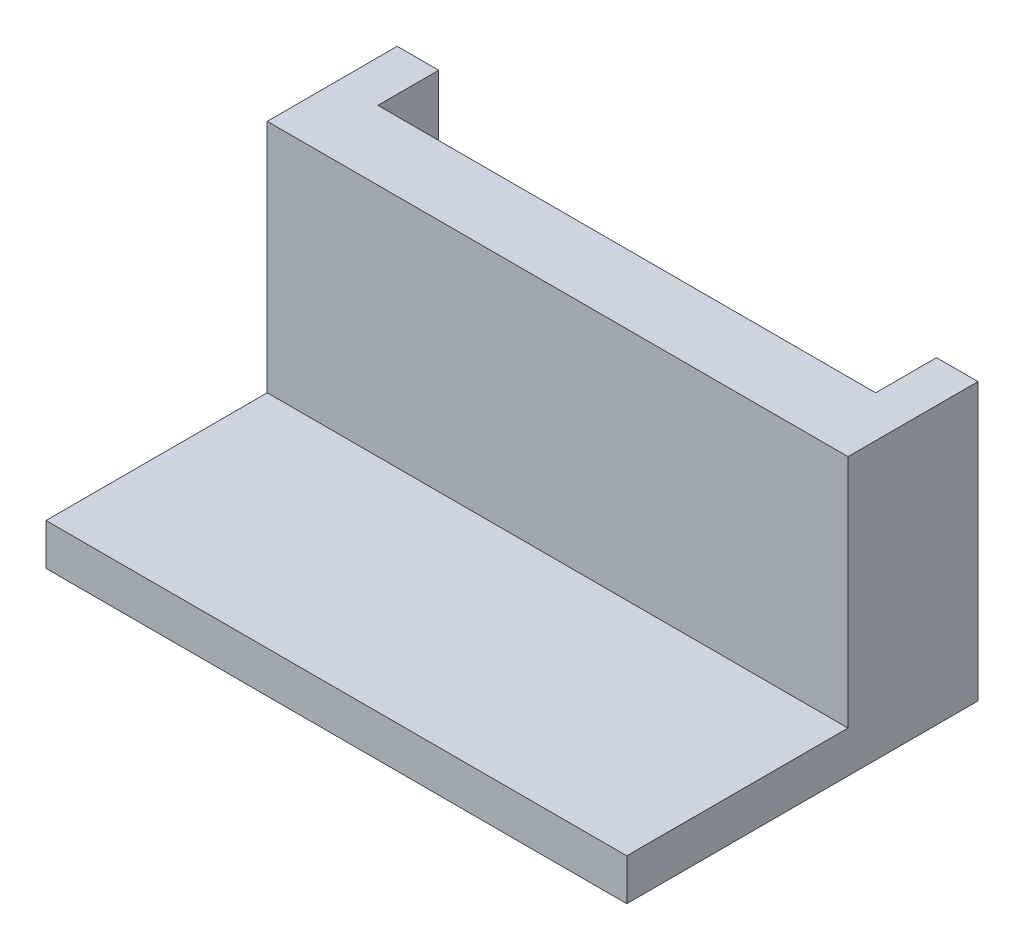
ISO-10303-21;
HEADER;
FILE_DESCRIPTION(('STEP AP214'),'2;1');
FILE_NAME('part.step','',(''),(''),'','','');
FILE_SCHEMA(('AUTOMOTIVE_DESIGN { 1 0 10303 214 1 1 1 1 }'));
ENDSEC;
DATA;
#1=APPLICATION_CONTEXT('core data for automotive mechanical design processes');
#2=APPLICATION_PROTOCOL_DEFINITION('international standard','automotive_design',2000,#1);
#3=PRODUCT_CONTEXT('',#1,'mechanical');
#4=PRODUCT('Part','Part','',(#3));
#5=PRODUCT_RELATED_PRODUCT_CATEGORY('part','',(#4));
#6=PRODUCT_DEFINITION_FORMATION('','',#4);
#7=PRODUCT_DEFINITION_CONTEXT('part definition',#1,'design');
#8=PRODUCT_DEFINITION('design','',#6,#7);
#9=PRODUCT_DEFINITION_SHAPE('','',#8);
#10=(LENGTH_UNIT() NAMED_UNIT(*) SI_UNIT(.MILLI.,.METRE.));
#11=(NAMED_UNIT(*) PLANE_ANGLE_UNIT() SI_UNIT($,.RADIAN.));
#12=(NAMED_UNIT(*) SI_UNIT($,.STERADIAN.) SOLID_ANGLE_UNIT());
#13=UNCERTAINTY_MEASURE_WITH_UNIT(LENGTH_MEASURE(1.E-05),#10,'distance_accuracy_value','');
#14=(GEOMETRIC_REPRESENTATION_CONTEXT(3) GLOBAL_UNCERTAINTY_ASSIGNED_CONTEXT((#13)) GLOBAL_UNIT_ASSIGNED_CONTEXT((#10,
#11,#12)) REPRESENTATION_CONTEXT('',''));
#15=CARTESIAN_POINT('',(0.,0.,0.));
#16=DIRECTION('',(0.,0.,1.));
#17=DIRECTION('',(1.,0.,0.));
#18=AXIS2_PLACEMENT_3D('',#15,#16,#17);
#19=CARTESIAN_POINT('',(-3.08154506437768,1.5,3.19785407725322));
#20=DIRECTION('',(0.,0.,-1.));
#21=DIRECTION('',(-1.,0.,0.));
#22=AXIS2_PLACEMENT_3D('',#19,#20,#21);
#23=PLANE('',#22);
#24=DIRECTION('',(-1.,0.,0.));
#25=VECTOR('',#24,1.);
#26=CARTESIAN_POINT('',(-4.58154506437768,1.5,3.19785407725322));
#27=LINE('',#26,#25);
#28=CARTESIAN_POINT('',(16.4184549356223,1.5,3.19785407725322));
#29=VERTEX_POINT('',#28);
#30=CARTESIAN_POINT('',(-4.58154506437768,1.5,3.19785407725322));
#31=VERTEX_POINT('',#30);
#32=EDGE_CURVE('E48',#29,#31,#27,.T.);
#33=ORIENTED_EDGE('',*,*,#32,.F.);
#34=DIRECTION('',(0.,-1.,0.));
#35=VECTOR('',#34,1.);
#36=CARTESIAN_POINT('',(16.4184549356223,10.,3.19785407725322));
#37=LINE('',#36,#35);
#38=CARTESIAN_POINT('',(16.4184549356223,10.,3.19785407725322));
#39=VERTEX_POINT('',#38);
#40=EDGE_CURVE('E194',#39,#29,#37,.T.);
#41=ORIENTED_EDGE('',*,*,#40,.F.);
#42=DIRECTION('',(1.,0.,0.));
#43=VECTOR('',#42,1.);
#44=CARTESIAN_POINT('',(-3.08154506437768,10.,3.19785407725322));
#45=LINE('',#44,#43);
#46=CARTESIAN_POINT('',(-4.58154506437768,10.,3.19785407725322));
#47=VERTEX_POINT('',#46);
#48=EDGE_CURVE('E209',#47,#39,#45,.T.);
#49=ORIENTED_EDGE('',*,*,#48,.F.);
#50=DIRECTION('',(0.,1.,0.));
#51=VECTOR('',#50,1.);
#52=CARTESIAN_POINT('',(-4.58154506437768,10.,3.19785407725322));
#53=LINE('',#52,#51);
#54=EDGE_CURVE('E182',#31,#47,#53,.T.);
#55=ORIENTED_EDGE('',*,*,#54,.F.);
#56=EDGE_LOOP('',(#33,#41,#49,#55));
#57=FACE_BOUND('',#56,.T.);
#58=ADVANCED_FACE('F33',(#57),#23,.F.);
#59=CARTESIAN_POINT('',(0.,1.5,0.));
#60=DIRECTION('',(0.,1.,0.));
#61=DIRECTION('',(0.,0.,1.));
#62=AXIS2_PLACEMENT_3D('',#59,#60,#61);
#63=PLANE('',#62);
#64=DIRECTION('',(1.,0.,0.));
#65=VECTOR('',#64,1.);
#66=CARTESIAN_POINT('',(14.9184549356223,1.5,-0.602145922746781));
#67=LINE('',#66,#65);
#68=CARTESIAN_POINT('',(9.91845493562231,1.5,-0.602145922746781));
#69=VERTEX_POINT('',#68);
#70=CARTESIAN_POINT('',(14.9184549356223,1.5,-0.602145922746781));
#71=VERTEX_POINT('',#70);
#72=EDGE_CURVE('E219',#69,#71,#67,.T.);
#73=ORIENTED_EDGE('',*,*,#72,.F.);
#74=DIRECTION('',(0.,0.,1.));
#75=VECTOR('',#74,1.);
#76=CARTESIAN_POINT('',(9.91845493562232,1.5,-1.50214592274678));
#77=LINE('',#76,#75);
#78=CARTESIAN_POINT('',(9.91845493562232,1.5,-1.50214592274678));
#79=VERTEX_POINT('',#78);
#80=EDGE_CURVE('E214',#79,#69,#77,.T.);
#81=ORIENTED_EDGE('',*,*,#80,.F.);
#82=DIRECTION('',(1.,0.,0.));
#83=VECTOR('',#82,1.);
#84=CARTESIAN_POINT('',(-3.08154506437768,1.5,-1.50214592274678));
#85=LINE('',#84,#83);
#86=CARTESIAN_POINT('',(1.91845493562232,1.5,-1.50214592274678));
#87=VERTEX_POINT('',#86);
#88=EDGE_CURVE('E11',#87,#79,#85,.T.);
#89=ORIENTED_EDGE('',*,*,#88,.F.);
#90=DIRECTION('',(0.,0.,-1.));
#91=VECTOR('',#90,1.);
#92=CARTESIAN_POINT('',(1.91845493562232,1.5,-1.50214592274678));
#93=LINE('',#92,#91);
#94=CARTESIAN_POINT('',(1.91845493562232,1.5,-0.602145922746781));
#95=VERTEX_POINT('',#94);
#96=EDGE_CURVE('E248',#95,#87,#93,.T.);
#97=ORIENTED_EDGE('',*,*,#96,.F.);
#98=DIRECTION('',(1.,0.,0.));
#99=VECTOR('',#98,1.);
#100=CARTESIAN_POINT('',(-3.08154506437768,1.5,-0.602145922746781));
#101=LINE('',#100,#99);
#102=CARTESIAN_POINT('',(-3.08154506437768,1.5,-0.602145922746781));
#103=VERTEX_POINT('',#102);
#104=EDGE_CURVE('E243',#103,#95,#101,.T.);
#105=ORIENTED_EDGE('',*,*,#104,.F.);
#106=DIRECTION('',(0.,0.,1.));
#107=VECTOR('',#106,1.);
#108=CARTESIAN_POINT('',(-3.08154506437768,1.5,-1.50214592274678));
#109=LINE('',#108,#107);
#110=CARTESIAN_POINT('',(-3.08154506437768,1.5,0.697854077253219));
#111=VERTEX_POINT('',#110);
#112=EDGE_CURVE('E268',#103,#111,#109,.T.);
#113=ORIENTED_EDGE('',*,*,#112,.T.);
#114=DIRECTION('',(-1.,0.,0.));
#115=VECTOR('',#114,1.);
#116=CARTESIAN_POINT('',(-3.08154506437768,1.5,0.697854077253219));
#117=LINE('',#116,#115);
#118=CARTESIAN_POINT('',(14.9184549356223,1.5,0.69785407725322));
#119=VERTEX_POINT('',#118);
#120=EDGE_CURVE('E236',#119,#111,#117,.T.);
#121=ORIENTED_EDGE('',*,*,#120,.F.);
#122=DIRECTION('',(0.,0.,1.));
#123=VECTOR('',#122,1.);
#124=CARTESIAN_POINT('',(14.9184549356223,1.5,-1.50214592274678));
#125=LINE('',#124,#123);
#126=EDGE_CURVE('E41',#71,#119,#125,.T.);
#127=ORIENTED_EDGE('',*,*,#126,.F.);
#128=EDGE_LOOP('',(#73,#81,#89,#97,#105,#113,#121,#127));
#129=FACE_BOUND('',#128,.T.);
#130=ADVANCED_FACE('F303',(#129),#63,.T.);
#131=CARTESIAN_POINT('',(-3.08154506437768,1.5,-1.50214592274678));
#132=DIRECTION('',(0.,0.,-1.));
#133=DIRECTION('',(-1.,0.,0.));
#134=AXIS2_PLACEMENT_3D('',#131,#132,#133);
#135=PLANE('',#134);
#136=DIRECTION('',(1.,0.,0.));
#137=VECTOR('',#136,1.);
#138=CARTESIAN_POINT('',(-3.08154506437768,0.,-1.50214592274678));
#139=LINE('',#138,#137);
#140=CARTESIAN_POINT('',(-4.58154506437768,0.,-1.50214592274678));
#141=VERTEX_POINT('',#140);
#142=CARTESIAN_POINT('',(16.4184549356223,0.,-1.50214592274678));
#143=VERTEX_POINT('',#142);
#144=EDGE_CURVE('E36',#141,#143,#139,.T.);
#145=ORIENTED_EDGE('',*,*,#144,.F.);
#146=DIRECTION('',(0.,-1.,0.));
#147=VECTOR('',#146,1.);
#148=CARTESIAN_POINT('',(-4.58154506437768,10.,-1.50214592274678));
#149=LINE('',#148,#147);
#150=CARTESIAN_POINT('',(-4.58154506437768,10.,-1.50214592274678));
#151=VERTEX_POINT('',#150);
#152=EDGE_CURVE('E154',#151,#141,#149,.T.);
#153=ORIENTED_EDGE('',*,*,#152,.F.);
#154=DIRECTION('',(1.,0.,0.));
#155=VECTOR('',#154,1.);
#156=CARTESIAN_POINT('',(-4.58154506437768,10.,-1.50214592274678));
#157=LINE('',#156,#155);
#158=CARTESIAN_POINT('',(-3.08154506437768,10.,-1.50214592274678));
#159=VERTEX_POINT('',#158);
#160=EDGE_CURVE('E156',#151,#159,#157,.T.);
#161=ORIENTED_EDGE('',*,*,#160,.T.);
#162=DIRECTION('',(0.,-1.,0.));
#163=VECTOR('',#162,1.);
#164=CARTESIAN_POINT('',(-3.08154506437768,10.,-1.50214592274678));
#165=LINE('',#164,#163);
#166=CARTESIAN_POINT('',(-3.08154506437768,6.,-1.50214592274678));
#167=VERTEX_POINT('',#166);
#168=EDGE_CURVE('E185',#159,#167,#165,.T.);
#169=ORIENTED_EDGE('',*,*,#168,.T.);
#170=DIRECTION('',(-1.,0.,0.));
#171=VECTOR('',#170,1.);
#172=CARTESIAN_POINT('',(-3.08154506437768,6.,-1.50214592274678));
#173=LINE('',#172,#171);
#174=CARTESIAN_POINT('',(1.91845493562232,6.,-1.50214592274678));
#175=VERTEX_POINT('',#174);
#176=EDGE_CURVE('E252',#175,#167,#173,.T.);
#177=ORIENTED_EDGE('',*,*,#176,.F.);
#178=DIRECTION('',(0.,-1.,0.));
#179=VECTOR('',#178,1.);
#180=CARTESIAN_POINT('',(1.91845493562232,6.,-1.50214592274678));
#181=LINE('',#180,#179);
#182=EDGE_CURVE('E255',#175,#87,#181,.T.);
#183=ORIENTED_EDGE('',*,*,#182,.T.);
#184=ORIENTED_EDGE('',*,*,#88,.T.);
#185=DIRECTION('',(0.,-1.,0.));
#186=VECTOR('',#185,1.);
#187=CARTESIAN_POINT('',(9.91845493562232,6.,-1.50214592274678));
#188=LINE('',#187,#186);
#189=CARTESIAN_POINT('',(9.91845493562232,6.,-1.50214592274678));
#190=VERTEX_POINT('',#189);
#191=EDGE_CURVE('E234',#190,#79,#188,.T.);
#192=ORIENTED_EDGE('',*,*,#191,.F.);
#193=DIRECTION('',(-1.,0.,0.));
#194=VECTOR('',#193,1.);
#195=CARTESIAN_POINT('',(14.9184549356223,6.,-1.50214592274678));
#196=LINE('',#195,#194);
#197=CARTESIAN_POINT('',(14.9184549356223,6.,-1.50214592274678));
#198=VERTEX_POINT('',#197);
#199=EDGE_CURVE('E218',#198,#190,#196,.T.);
#200=ORIENTED_EDGE('',*,*,#199,.F.);
#201=DIRECTION('',(0.,1.,0.));
#202=VECTOR('',#201,1.);
#203=CARTESIAN_POINT('',(14.9184549356223,10.,-1.50214592274678));
#204=LINE('',#203,#202);
#205=CARTESIAN_POINT('',(14.9184549356223,10.,-1.50214592274678));
#206=VERTEX_POINT('',#205);
#207=EDGE_CURVE('E193',#198,#206,#204,.T.);
#208=ORIENTED_EDGE('',*,*,#207,.T.);
#209=DIRECTION('',(-1.,0.,0.));
#210=VECTOR('',#209,1.);
#211=CARTESIAN_POINT('',(16.4184549356223,10.,-1.50214592274678));
#212=LINE('',#211,#210);
#213=CARTESIAN_POINT('',(16.4184549356223,10.,-1.50214592274678));
#214=VERTEX_POINT('',#213);
#215=EDGE_CURVE('E203',#214,#206,#212,.T.);
#216=ORIENTED_EDGE('',*,*,#215,.F.);
#217=DIRECTION('',(0.,1.,0.));
#218=VECTOR('',#217,1.);
#219=CARTESIAN_POINT('',(16.4184549356223,10.,-1.50214592274678));
#220=LINE('',#219,#218);
#221=EDGE_CURVE('E198',#143,#214,#220,.T.);
#222=ORIENTED_EDGE('',*,*,#221,.F.);
#223=EDGE_LOOP('',(#145,#153,#161,#169,#177,#183,#184,#192,#200,#208,#216,#222));
#224=FACE_BOUND('',#223,.T.);
#225=ADVANCED_FACE('F280',(#224),#135,.T.);
#226=CARTESIAN_POINT('',(0.,0.,0.));
#227=DIRECTION('',(0.,1.,0.));
#228=DIRECTION('',(0.,0.,1.));
#229=AXIS2_PLACEMENT_3D('',#226,#227,#228);
#230=PLANE('',#229);
#231=DIRECTION('',(0.,0.,-1.));
#232=VECTOR('',#231,1.);
#233=CARTESIAN_POINT('',(16.4184549356223,0.,3.19785407725322));
#234=LINE('',#233,#232);
#235=CARTESIAN_POINT('',(16.4184549356223,0.,11.1978540772532));
#236=VERTEX_POINT('',#235);
#237=EDGE_CURVE('E162',#236,#143,#234,.T.);
#238=ORIENTED_EDGE('',*,*,#237,.F.);
#239=DIRECTION('',(1.,0.,0.));
#240=VECTOR('',#239,1.);
#241=CARTESIAN_POINT('',(-4.58154506437768,0.,11.1978540772532));
#242=LINE('',#241,#240);
#243=CARTESIAN_POINT('',(-4.58154506437768,0.,11.1978540772532));
#244=VERTEX_POINT('',#243);
#245=EDGE_CURVE('E159',#244,#236,#242,.T.);
#246=ORIENTED_EDGE('',*,*,#245,.F.);
#247=DIRECTION('',(0.,0.,1.));
#248=VECTOR('',#247,1.);
#249=CARTESIAN_POINT('',(-4.58154506437768,0.,3.19785407725322));
#250=LINE('',#249,#248);
#251=EDGE_CURVE('E147',#141,#244,#250,.T.);
#252=ORIENTED_EDGE('',*,*,#251,.F.);
#253=ORIENTED_EDGE('',*,*,#144,.T.);
#254=EDGE_LOOP('',(#238,#246,#252,#253));
#255=FACE_BOUND('',#254,.T.);
#256=ADVANCED_FACE('F160',(#255),#230,.F.);
#257=CARTESIAN_POINT('',(-3.08154506437768,6.,-0.602145922746781));
#258=DIRECTION('',(0.,0.,-1.));
#259=DIRECTION('',(-1.,0.,0.));
#260=AXIS2_PLACEMENT_3D('',#257,#258,#259);
#261=PLANE('',#260);
#262=ORIENTED_EDGE('',*,*,#104,.T.);
#263=DIRECTION('',(0.,-1.,0.));
#264=VECTOR('',#263,1.);
#265=CARTESIAN_POINT('',(1.91845493562232,6.,-0.602145922746781));
#266=LINE('',#265,#264);
#267=CARTESIAN_POINT('',(1.91845493562232,6.,-0.602145922746781));
#268=VERTEX_POINT('',#267);
#269=EDGE_CURVE('E262',#268,#95,#266,.T.);
#270=ORIENTED_EDGE('',*,*,#269,.F.);
#271=DIRECTION('',(1.,0.,0.));
#272=VECTOR('',#271,1.);
#273=CARTESIAN_POINT('',(-3.08154506437768,6.,-0.602145922746781));
#274=LINE('',#273,#272);
#275=CARTESIAN_POINT('',(-3.08154506437768,6.,-0.602145922746781));
#276=VERTEX_POINT('',#275);
#277=EDGE_CURVE('E247',#276,#268,#274,.T.);
#278=ORIENTED_EDGE('',*,*,#277,.F.);
#279=DIRECTION('',(0.,-1.,0.));
#280=VECTOR('',#279,1.);
#281=CARTESIAN_POINT('',(-3.08154506437768,6.,-0.602145922746781));
#282=LINE('',#281,#280);
#283=EDGE_CURVE('E265',#276,#103,#282,.T.);
#284=ORIENTED_EDGE('',*,*,#283,.T.);
#285=EDGE_LOOP('',(#262,#270,#278,#284));
#286=FACE_BOUND('',#285,.T.);
#287=ADVANCED_FACE('F314',(#286),#261,.F.);
#288=CARTESIAN_POINT('',(1.91845493562232,6.,-1.50214592274678));
#289=DIRECTION('',(-1.,0.,0.));
#290=DIRECTION('',(0.,0.,1.));
#291=AXIS2_PLACEMENT_3D('',#288,#289,#290);
#292=PLANE('',#291);
#293=ORIENTED_EDGE('',*,*,#96,.T.);
#294=ORIENTED_EDGE('',*,*,#182,.F.);
#295=DIRECTION('',(0.,0.,-1.));
#296=VECTOR('',#295,1.);
#297=CARTESIAN_POINT('',(1.91845493562232,6.,-1.50214592274678));
#298=LINE('',#297,#296);
#299=EDGE_CURVE('E250',#268,#175,#298,.T.);
#300=ORIENTED_EDGE('',*,*,#299,.F.);
#301=ORIENTED_EDGE('',*,*,#269,.T.);
#302=EDGE_LOOP('',(#293,#294,#300,#301));
#303=FACE_BOUND('',#302,.T.);
#304=ADVANCED_FACE('F320',(#303),#292,.F.);
#305=CARTESIAN_POINT('',(0.,6.,0.));
#306=DIRECTION('',(0.,1.,0.));
#307=DIRECTION('',(0.,0.,1.));
#308=AXIS2_PLACEMENT_3D('',#305,#306,#307);
#309=PLANE('',#308);
#310=DIRECTION('',(0.,0.,1.));
#311=VECTOR('',#310,1.);
#312=CARTESIAN_POINT('',(-3.08154506437768,6.,-1.50214592274678));
#313=LINE('',#312,#311);
#314=EDGE_CURVE('E244',#167,#276,#313,.T.);
#315=ORIENTED_EDGE('',*,*,#314,.T.);
#316=ORIENTED_EDGE('',*,*,#277,.T.);
#317=ORIENTED_EDGE('',*,*,#299,.T.);
#318=ORIENTED_EDGE('',*,*,#176,.T.);
#319=EDGE_LOOP('',(#315,#316,#317,#318));
#320=FACE_BOUND('',#319,.T.);
#321=ADVANCED_FACE('F325',(#320),#309,.T.);
#322=CARTESIAN_POINT('',(-3.08154506437768,6.,0.697854077253219));
#323=DIRECTION('',(0.,0.,1.));
#324=DIRECTION('',(1.,0.,0.));
#325=AXIS2_PLACEMENT_3D('',#322,#323,#324);
#326=PLANE('',#325);
#327=ORIENTED_EDGE('',*,*,#120,.T.);
#328=DIRECTION('',(0.,-1.,0.));
#329=VECTOR('',#328,1.);
#330=CARTESIAN_POINT('',(-3.08154506437768,6.,0.697854077253219));
#331=LINE('',#330,#329);
#332=CARTESIAN_POINT('',(-3.08154506437768,10.,0.697854077253219));
#333=VERTEX_POINT('',#332);
#334=EDGE_CURVE('E239',#333,#111,#331,.T.);
#335=ORIENTED_EDGE('',*,*,#334,.F.);
#336=DIRECTION('',(-1.,0.,0.));
#337=VECTOR('',#336,1.);
#338=CARTESIAN_POINT('',(-3.08154506437768,10.,0.697854077253219));
#339=LINE('',#338,#337);
#340=CARTESIAN_POINT('',(14.9184549356223,10.,0.697854077253219));
#341=VERTEX_POINT('',#340);
#342=EDGE_CURVE('E211',#341,#333,#339,.T.);
#343=ORIENTED_EDGE('',*,*,#342,.F.);
#344=DIRECTION('',(0.,-1.,0.));
#345=VECTOR('',#344,1.);
#346=CARTESIAN_POINT('',(14.9184549356223,6.,0.69785407725322));
#347=LINE('',#346,#345);
#348=EDGE_CURVE('E241',#341,#119,#347,.T.);
#349=ORIENTED_EDGE('',*,*,#348,.T.);
#350=EDGE_LOOP('',(#327,#335,#343,#349));
#351=FACE_BOUND('',#350,.T.);
#352=ADVANCED_FACE('F350',(#351),#326,.F.);
#353=CARTESIAN_POINT('',(9.91845493562232,6.,-1.50214592274678));
#354=DIRECTION('',(1.,0.,0.));
#355=DIRECTION('',(0.,0.,-1.));
#356=AXIS2_PLACEMENT_3D('',#353,#354,#355);
#357=PLANE('',#356);
#358=ORIENTED_EDGE('',*,*,#80,.T.);
#359=DIRECTION('',(0.,-1.,0.));
#360=VECTOR('',#359,1.);
#361=CARTESIAN_POINT('',(9.91845493562231,6.,-0.602145922746781));
#362=LINE('',#361,#360);
#363=CARTESIAN_POINT('',(9.91845493562231,6.,-0.602145922746781));
#364=VERTEX_POINT('',#363);
#365=EDGE_CURVE('E231',#364,#69,#362,.T.);
#366=ORIENTED_EDGE('',*,*,#365,.F.);
#367=DIRECTION('',(0.,0.,1.));
#368=VECTOR('',#367,1.);
#369=CARTESIAN_POINT('',(9.91845493562232,6.,-1.50214592274678));
#370=LINE('',#369,#368);
#371=EDGE_CURVE('E221',#190,#364,#370,.T.);
#372=ORIENTED_EDGE('',*,*,#371,.F.);
#373=ORIENTED_EDGE('',*,*,#191,.T.);
#374=EDGE_LOOP('',(#358,#366,#372,#373));
#375=FACE_BOUND('',#374,.T.);
#376=ADVANCED_FACE('F339',(#375),#357,.F.);
#377=CARTESIAN_POINT('',(14.9184549356223,6.,-0.602145922746781));
#378=DIRECTION('',(0.,0.,-1.));
#379=DIRECTION('',(-1.,0.,0.));
#380=AXIS2_PLACEMENT_3D('',#377,#378,#379);
#381=PLANE('',#380);
#382=ORIENTED_EDGE('',*,*,#72,.T.);
#383=DIRECTION('',(0.,-1.,0.));
#384=VECTOR('',#383,1.);
#385=CARTESIAN_POINT('',(14.9184549356223,6.,-0.602145922746781));
#386=LINE('',#385,#384);
#387=CARTESIAN_POINT('',(14.9184549356223,6.,-0.602145922746781));
#388=VERTEX_POINT('',#387);
#389=EDGE_CURVE('E226',#388,#71,#386,.T.);
#390=ORIENTED_EDGE('',*,*,#389,.F.);
#391=DIRECTION('',(1.,0.,0.));
#392=VECTOR('',#391,1.);
#393=CARTESIAN_POINT('',(14.9184549356223,6.,-0.602145922746781));
#394=LINE('',#393,#392);
#395=EDGE_CURVE('E223',#364,#388,#394,.T.);
#396=ORIENTED_EDGE('',*,*,#395,.F.);
#397=ORIENTED_EDGE('',*,*,#365,.T.);
#398=EDGE_LOOP('',(#382,#390,#396,#397));
#399=FACE_BOUND('',#398,.T.);
#400=ADVANCED_FACE('F342',(#399),#381,.F.);
#401=CARTESIAN_POINT('',(0.,6.,0.));
#402=DIRECTION('',(0.,-1.,0.));
#403=DIRECTION('',(0.,0.,-1.));
#404=AXIS2_PLACEMENT_3D('',#401,#402,#403);
#405=PLANE('',#404);
#406=DIRECTION('',(0.,0.,-1.));
#407=VECTOR('',#406,1.);
#408=CARTESIAN_POINT('',(14.9184549356223,6.,-1.50214592274678));
#409=LINE('',#408,#407);
#410=EDGE_CURVE('E215',#388,#198,#409,.T.);
#411=ORIENTED_EDGE('',*,*,#410,.T.);
#412=ORIENTED_EDGE('',*,*,#199,.T.);
#413=ORIENTED_EDGE('',*,*,#371,.T.);
#414=ORIENTED_EDGE('',*,*,#395,.T.);
#415=EDGE_LOOP('',(#411,#412,#413,#414));
#416=FACE_BOUND('',#415,.T.);
#417=ADVANCED_FACE('F345',(#416),#405,.F.);
#418=CARTESIAN_POINT('',(0.,10.,0.));
#419=DIRECTION('',(0.,1.,0.));
#420=DIRECTION('',(0.,0.,1.));
#421=AXIS2_PLACEMENT_3D('',#418,#419,#420);
#422=PLANE('',#421);
#423=ORIENTED_EDGE('',*,*,#342,.T.);
#424=DIRECTION('',(0.,0.,-1.));
#425=VECTOR('',#424,1.);
#426=CARTESIAN_POINT('',(-3.08154506437768,10.,3.19785407725322));
#427=LINE('',#426,#425);
#428=EDGE_CURVE('E181',#333,#159,#427,.T.);
#429=ORIENTED_EDGE('',*,*,#428,.T.);
#430=ORIENTED_EDGE('',*,*,#160,.F.);
#431=DIRECTION('',(0.,0.,-1.));
#432=VECTOR('',#431,1.);
#433=CARTESIAN_POINT('',(-4.58154506437768,10.,3.19785407725322));
#434=LINE('',#433,#432);
#435=EDGE_CURVE('E184',#47,#151,#434,.T.);
#436=ORIENTED_EDGE('',*,*,#435,.F.);
#437=ORIENTED_EDGE('',*,*,#48,.T.);
#438=DIRECTION('',(0.,0.,1.));
#439=VECTOR('',#438,1.);
#440=CARTESIAN_POINT('',(16.4184549356223,10.,3.19785407725322));
#441=LINE('',#440,#439);
#442=EDGE_CURVE('E200',#214,#39,#441,.T.);
#443=ORIENTED_EDGE('',*,*,#442,.F.);
#444=ORIENTED_EDGE('',*,*,#215,.T.);
#445=DIRECTION('',(0.,0.,1.));
#446=VECTOR('',#445,1.);
#447=CARTESIAN_POINT('',(14.9184549356223,10.,3.19785407725322));
#448=LINE('',#447,#446);
#449=EDGE_CURVE('E196',#206,#341,#448,.T.);
#450=ORIENTED_EDGE('',*,*,#449,.T.);
#451=EDGE_LOOP('',(#423,#429,#430,#436,#437,#443,#444,#450));
#452=FACE_BOUND('',#451,.T.);
#453=ADVANCED_FACE('F285',(#452),#422,.T.);
#454=CARTESIAN_POINT('',(16.4184549356223,0.,0.));
#455=DIRECTION('',(1.,0.,0.));
#456=DIRECTION('',(0.,0.,-1.));
#457=AXIS2_PLACEMENT_3D('',#454,#455,#456);
#458=PLANE('',#457);
#459=ORIENTED_EDGE('',*,*,#40,.T.);
#460=DIRECTION('',(0.,0.,-1.));
#461=VECTOR('',#460,1.);
#462=CARTESIAN_POINT('',(16.4184549356223,1.5,11.1978540772532));
#463=LINE('',#462,#461);
#464=CARTESIAN_POINT('',(16.4184549356223,1.5,11.1978540772532));
#465=VERTEX_POINT('',#464);
#466=EDGE_CURVE('E178',#465,#29,#463,.T.);
#467=ORIENTED_EDGE('',*,*,#466,.F.);
#468=DIRECTION('',(0.,1.,0.));
#469=VECTOR('',#468,1.);
#470=CARTESIAN_POINT('',(16.4184549356223,0.,11.1978540772532));
#471=LINE('',#470,#469);
#472=EDGE_CURVE('E165',#236,#465,#471,.T.);
#473=ORIENTED_EDGE('',*,*,#472,.F.);
#474=ORIENTED_EDGE('',*,*,#237,.T.);
#475=ORIENTED_EDGE('',*,*,#221,.T.);
#476=ORIENTED_EDGE('',*,*,#442,.T.);
#477=EDGE_LOOP('',(#459,#467,#473,#474,#475,#476));
#478=FACE_BOUND('',#477,.T.);
#479=ADVANCED_FACE('F277',(#478),#458,.T.);
#480=CARTESIAN_POINT('',(14.9184549356223,0.,0.));
#481=DIRECTION('',(1.,0.,0.));
#482=DIRECTION('',(0.,0.,-1.));
#483=AXIS2_PLACEMENT_3D('',#480,#481,#482);
#484=PLANE('',#483);
#485=ORIENTED_EDGE('',*,*,#410,.F.);
#486=ORIENTED_EDGE('',*,*,#389,.T.);
#487=ORIENTED_EDGE('',*,*,#126,.T.);
#488=ORIENTED_EDGE('',*,*,#348,.F.);
#489=ORIENTED_EDGE('',*,*,#449,.F.);
#490=ORIENTED_EDGE('',*,*,#207,.F.);
#491=EDGE_LOOP('',(#485,#486,#487,#488,#489,#490));
#492=FACE_BOUND('',#491,.T.);
#493=ADVANCED_FACE('F346',(#492),#484,.F.);
#494=CARTESIAN_POINT('',(-4.58154506437768,0.,0.));
#495=DIRECTION('',(1.,0.,0.));
#496=DIRECTION('',(0.,0.,-1.));
#497=AXIS2_PLACEMENT_3D('',#494,#495,#496);
#498=PLANE('',#497);
#499=ORIENTED_EDGE('',*,*,#251,.T.);
#500=DIRECTION('',(0.,-1.,0.));
#501=VECTOR('',#500,1.);
#502=CARTESIAN_POINT('',(-4.58154506437768,0.,11.1978540772532));
#503=LINE('',#502,#501);
#504=CARTESIAN_POINT('',(-4.58154506437768,1.5,11.1978540772532));
#505=VERTEX_POINT('',#504);
#506=EDGE_CURVE('E152',#505,#244,#503,.T.);
#507=ORIENTED_EDGE('',*,*,#506,.F.);
#508=DIRECTION('',(0.,0.,-1.));
#509=VECTOR('',#508,1.);
#510=CARTESIAN_POINT('',(-4.58154506437768,1.5,11.1978540772532));
#511=LINE('',#510,#509);
#512=EDGE_CURVE('E175',#505,#31,#511,.T.);
#513=ORIENTED_EDGE('',*,*,#512,.T.);
#514=ORIENTED_EDGE('',*,*,#54,.T.);
#515=ORIENTED_EDGE('',*,*,#435,.T.);
#516=ORIENTED_EDGE('',*,*,#152,.T.);
#517=EDGE_LOOP('',(#499,#507,#513,#514,#515,#516));
#518=FACE_BOUND('',#517,.T.);
#519=ADVANCED_FACE('F149',(#518),#498,.F.);
#520=CARTESIAN_POINT('',(-3.08154506437768,0.,0.));
#521=DIRECTION('',(1.,0.,0.));
#522=DIRECTION('',(0.,0.,-1.));
#523=AXIS2_PLACEMENT_3D('',#520,#521,#522);
#524=PLANE('',#523);
#525=ORIENTED_EDGE('',*,*,#428,.F.);
#526=ORIENTED_EDGE('',*,*,#334,.T.);
#527=ORIENTED_EDGE('',*,*,#112,.F.);
#528=ORIENTED_EDGE('',*,*,#283,.F.);
#529=ORIENTED_EDGE('',*,*,#314,.F.);
#530=ORIENTED_EDGE('',*,*,#168,.F.);
#531=EDGE_LOOP('',(#525,#526,#527,#528,#529,#530));
#532=FACE_BOUND('',#531,.T.);
#533=ADVANCED_FACE('F292',(#532),#524,.T.);
#534=CARTESIAN_POINT('',(-4.58154506437768,1.5,11.1978540772532));
#535=DIRECTION('',(0.,-1.,0.));
#536=DIRECTION('',(1.,0.,0.));
#537=AXIS2_PLACEMENT_3D('',#534,#535,#536);
#538=PLANE('',#537);
#539=ORIENTED_EDGE('',*,*,#32,.T.);
#540=ORIENTED_EDGE('',*,*,#512,.F.);
#541=DIRECTION('',(-1.,0.,0.));
#542=VECTOR('',#541,1.);
#543=CARTESIAN_POINT('',(-4.58154506437768,1.5,11.1978540772532));
#544=LINE('',#543,#542);
#545=EDGE_CURVE('E169',#465,#505,#544,.T.);
#546=ORIENTED_EDGE('',*,*,#545,.F.);
#547=ORIENTED_EDGE('',*,*,#466,.T.);
#548=EDGE_LOOP('',(#539,#540,#546,#547));
#549=FACE_BOUND('',#548,.T.);
#550=ADVANCED_FACE('F290',(#549),#538,.F.);
#551=CARTESIAN_POINT('',(0.,0.,11.1978540772532));
#552=DIRECTION('',(0.,0.,-1.));
#553=DIRECTION('',(-1.,0.,0.));
#554=AXIS2_PLACEMENT_3D('',#551,#552,#553);
#555=PLANE('',#554);
#556=ORIENTED_EDGE('',*,*,#506,.T.);
#557=ORIENTED_EDGE('',*,*,#245,.T.);
#558=ORIENTED_EDGE('',*,*,#472,.T.);
#559=ORIENTED_EDGE('',*,*,#545,.T.);
#560=EDGE_LOOP('',(#556,#557,#558,#559));
#561=FACE_BOUND('',#560,.T.);
#562=ADVANCED_FACE('F167',(#561),#555,.F.);
#563=CLOSED_SHELL('',(#58,#130,#225,#256,#287,#304,#321,#352,#376,#400,#417,#453,#479,#493,#519,
#533,#550,#562));
#564=MANIFOLD_SOLID_BREP('B2',#563);
#565=ADVANCED_BREP_SHAPE_REPRESENTATION('',(#18,#564),#14);
#566=SHAPE_DEFINITION_REPRESENTATION(#9,#565);
ENDSEC;
END-ISO-10303-21;
